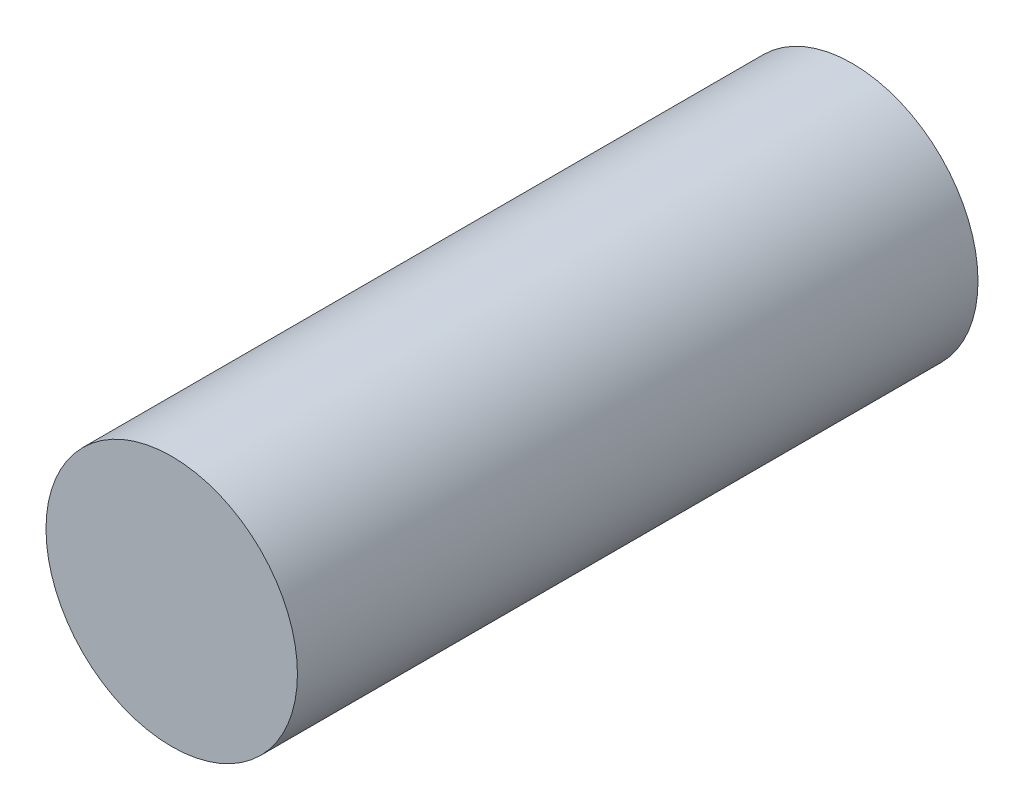
ISO-10303-21;
HEADER;
FILE_DESCRIPTION(('STEP AP214'),'2;1');
FILE_NAME('part.step','',(''),(''),'','','');
FILE_SCHEMA(('AUTOMOTIVE_DESIGN { 1 0 10303 214 1 1 1 1 }'));
ENDSEC;
DATA;
#1=APPLICATION_CONTEXT('core data for automotive mechanical design processes');
#2=APPLICATION_PROTOCOL_DEFINITION('international standard','automotive_design',2000,#1);
#3=PRODUCT_CONTEXT('',#1,'mechanical');
#4=PRODUCT('Part','Part','',(#3));
#5=PRODUCT_RELATED_PRODUCT_CATEGORY('part','',(#4));
#6=PRODUCT_DEFINITION_FORMATION('','',#4);
#7=PRODUCT_DEFINITION_CONTEXT('part definition',#1,'design');
#8=PRODUCT_DEFINITION('design','',#6,#7);
#9=PRODUCT_DEFINITION_SHAPE('','',#8);
#10=(LENGTH_UNIT() NAMED_UNIT(*) SI_UNIT(.MILLI.,.METRE.));
#11=(NAMED_UNIT(*) PLANE_ANGLE_UNIT() SI_UNIT($,.RADIAN.));
#12=(NAMED_UNIT(*) SI_UNIT($,.STERADIAN.) SOLID_ANGLE_UNIT());
#13=UNCERTAINTY_MEASURE_WITH_UNIT(LENGTH_MEASURE(1.E-05),#10,'distance_accuracy_value','');
#14=(GEOMETRIC_REPRESENTATION_CONTEXT(3) GLOBAL_UNCERTAINTY_ASSIGNED_CONTEXT((#13)) GLOBAL_UNIT_ASSIGNED_CONTEXT((#10,
#11,#12)) REPRESENTATION_CONTEXT('',''));
#15=CARTESIAN_POINT('',(0.,0.,0.));
#16=DIRECTION('',(0.,0.,1.));
#17=DIRECTION('',(1.,0.,0.));
#18=AXIS2_PLACEMENT_3D('',#15,#16,#17);
#19=CARTESIAN_POINT('',(0.,0.,4.06));
#20=DIRECTION('',(0.,0.,-1.));
#21=DIRECTION('',(-1.,0.,0.));
#22=AXIS2_PLACEMENT_3D('',#19,#20,#21);
#23=CYLINDRICAL_SURFACE('',#22,0.750000000000001);
#24=CARTESIAN_POINT('',(0.,0.,4.06));
#25=DIRECTION('',(0.,0.,1.));
#26=DIRECTION('',(1.,0.,0.));
#27=AXIS2_PLACEMENT_3D('',#24,#25,#26);
#28=CIRCLE('',#27,0.750000000000001);
#29=CARTESIAN_POINT('',(0.750000000000001,0.,4.06));
#30=VERTEX_POINT('',#29);
#31=EDGE_CURVE('E10',#30,#30,#28,.T.);
#32=ORIENTED_EDGE('',*,*,#31,.F.);
#33=EDGE_LOOP('',(#32));
#34=FACE_BOUND('',#33,.T.);
#35=CARTESIAN_POINT('',(0.,0.,0.));
#36=DIRECTION('',(0.,0.,1.));
#37=DIRECTION('',(1.,0.,0.));
#38=AXIS2_PLACEMENT_3D('',#35,#36,#37);
#39=CIRCLE('',#38,0.750000000000001);
#40=CARTESIAN_POINT('',(0.750000000000001,0.,0.));
#41=VERTEX_POINT('',#40);
#42=EDGE_CURVE('E42',#41,#41,#39,.T.);
#43=ORIENTED_EDGE('',*,*,#42,.T.);
#44=EDGE_LOOP('',(#43));
#45=FACE_BOUND('',#44,.T.);
#46=ADVANCED_FACE('F39',(#34,#45),#23,.T.);
#47=CARTESIAN_POINT('',(0.,0.,4.06));
#48=DIRECTION('',(0.,0.,1.));
#49=DIRECTION('',(1.,0.,0.));
#50=AXIS2_PLACEMENT_3D('',#47,#48,#49);
#51=PLANE('',#50);
#52=ORIENTED_EDGE('',*,*,#31,.T.);
#53=EDGE_LOOP('',(#52));
#54=FACE_BOUND('',#53,.T.);
#55=ADVANCED_FACE('F54',(#54),#51,.T.);
#56=CARTESIAN_POINT('',(0.,0.,0.));
#57=DIRECTION('',(0.,0.,1.));
#58=DIRECTION('',(1.,0.,0.));
#59=AXIS2_PLACEMENT_3D('',#56,#57,#58);
#60=PLANE('',#59);
#61=ORIENTED_EDGE('',*,*,#42,.F.);
#62=EDGE_LOOP('',(#61));
#63=FACE_BOUND('',#62,.T.);
#64=ADVANCED_FACE('F52',(#63),#60,.F.);
#65=CLOSED_SHELL('',(#46,#55,#64));
#66=MANIFOLD_SOLID_BREP('B2',#65);
#67=ADVANCED_BREP_SHAPE_REPRESENTATION('',(#18,#66),#14);
#68=SHAPE_DEFINITION_REPRESENTATION(#9,#67);
ENDSEC;
END-ISO-10303-21;
